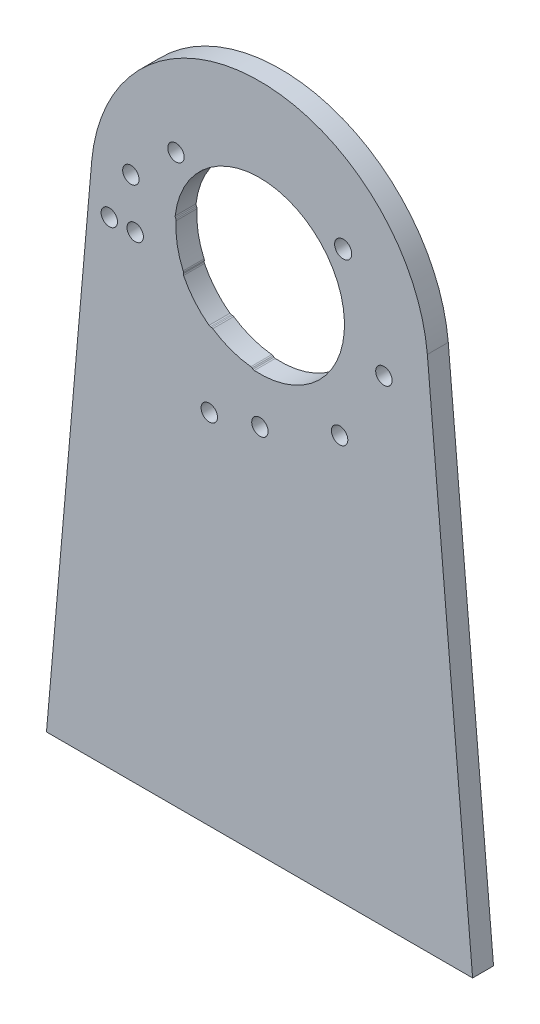
ISO-10303-21;
HEADER;
FILE_DESCRIPTION(('STEP AP214'),'2;1');
FILE_NAME('part.step','',(''),(''),'','','');
FILE_SCHEMA(('AUTOMOTIVE_DESIGN { 1 0 10303 214 1 1 1 1 }'));
ENDSEC;
DATA;
#1=APPLICATION_CONTEXT('core data for automotive mechanical design processes');
#2=APPLICATION_PROTOCOL_DEFINITION('international standard','automotive_design',2000,#1);
#3=PRODUCT_CONTEXT('',#1,'mechanical');
#4=PRODUCT('Part','Part','',(#3));
#5=PRODUCT_RELATED_PRODUCT_CATEGORY('part','',(#4));
#6=PRODUCT_DEFINITION_FORMATION('','',#4);
#7=PRODUCT_DEFINITION_CONTEXT('part definition',#1,'design');
#8=PRODUCT_DEFINITION('design','',#6,#7);
#9=PRODUCT_DEFINITION_SHAPE('','',#8);
#10=(LENGTH_UNIT() NAMED_UNIT(*) SI_UNIT(.MILLI.,.METRE.));
#11=(NAMED_UNIT(*) PLANE_ANGLE_UNIT() SI_UNIT($,.RADIAN.));
#12=(NAMED_UNIT(*) SI_UNIT($,.STERADIAN.) SOLID_ANGLE_UNIT());
#13=UNCERTAINTY_MEASURE_WITH_UNIT(LENGTH_MEASURE(1.E-05),#10,'distance_accuracy_value','');
#14=(GEOMETRIC_REPRESENTATION_CONTEXT(3) GLOBAL_UNCERTAINTY_ASSIGNED_CONTEXT((#13)) GLOBAL_UNIT_ASSIGNED_CONTEXT((#10,
#11,#12)) REPRESENTATION_CONTEXT('',''));
#15=CARTESIAN_POINT('',(0.,0.,0.));
#16=DIRECTION('',(0.,0.,1.));
#17=DIRECTION('',(1.,0.,0.));
#18=AXIS2_PLACEMENT_3D('',#15,#16,#17);
#19=CARTESIAN_POINT('',(461.444713808389,195.326,6.35));
#20=DIRECTION('',(0.,0.,1.));
#21=DIRECTION('',(1.,0.,0.));
#22=AXIS2_PLACEMENT_3D('',#19,#20,#21);
#23=PLANE('',#22);
#24=CARTESIAN_POINT('',(422.353220898632,202.330354144289,6.35));
#25=DIRECTION('',(0.,0.,1.));
#26=DIRECTION('',(1.,0.,0.));
#27=AXIS2_PLACEMENT_3D('',#24,#25,#26);
#28=CIRCLE('',#27,2.48919999947282);
#29=CARTESIAN_POINT('',(424.842420898104,202.330354144289,6.35));
#30=VERTEX_POINT('',#29);
#31=EDGE_CURVE('E521',#30,#30,#28,.T.);
#32=ORIENTED_EDGE('',*,*,#31,.F.);
#33=EDGE_LOOP('',(#32));
#34=FACE_BOUND('',#33,.T.);
#35=CARTESIAN_POINT('',(499.212852118392,187.870994066722,6.35));
#36=DIRECTION('',(0.,0.,1.));
#37=DIRECTION('',(1.,0.,0.));
#38=AXIS2_PLACEMENT_3D('',#35,#36,#37);
#39=CIRCLE('',#38,2.48919999890583);
#40=CARTESIAN_POINT('',(501.702052117298,187.870994066722,6.35));
#41=VERTEX_POINT('',#40);
#42=EDGE_CURVE('E540',#41,#41,#39,.T.);
#43=ORIENTED_EDGE('',*,*,#42,.F.);
#44=EDGE_LOOP('',(#43));
#45=FACE_BOUND('',#44,.T.);
#46=CARTESIAN_POINT('',(485.770599058357,165.488763336674,6.35));
#47=DIRECTION('',(0.,0.,1.));
#48=DIRECTION('',(1.,0.,0.));
#49=AXIS2_PLACEMENT_3D('',#46,#47,#48);
#50=CIRCLE('',#49,2.48919999692566);
#51=CARTESIAN_POINT('',(488.259799055283,165.488763336674,6.35));
#52=VERTEX_POINT('',#51);
#53=EDGE_CURVE('E539',#52,#52,#50,.T.);
#54=ORIENTED_EDGE('',*,*,#53,.F.);
#55=EDGE_LOOP('',(#54));
#56=FACE_BOUND('',#55,.T.);
#57=CARTESIAN_POINT('',(415.800165798263,187.870994066722,6.35));
#58=DIRECTION('',(0.,0.,1.));
#59=DIRECTION('',(1.,0.,0.));
#60=AXIS2_PLACEMENT_3D('',#57,#58,#59);
#61=CIRCLE('',#60,2.48919999939926);
#62=CARTESIAN_POINT('',(418.289365797663,187.870994066722,6.35));
#63=VERTEX_POINT('',#62);
#64=EDGE_CURVE('E532',#63,#63,#61,.T.);
#65=ORIENTED_EDGE('',*,*,#64,.F.);
#66=EDGE_LOOP('',(#65));
#67=FACE_BOUND('',#66,.T.);
#68=DIRECTION('',(-0.087155742747404,-0.996194698091768,0.));
#69=VECTOR('',#68,1.);
#70=CARTESIAN_POINT('',(438.327565167459,184.801863992082,6.35));
#71=LINE('',#70,#69);
#72=CARTESIAN_POINT('',(438.309515675378,184.595557353553,6.35));
#73=VERTEX_POINT('',#72);
#74=CARTESIAN_POINT('',(438.278235551917,184.238023906358,6.35));
#75=VERTEX_POINT('',#74);
#76=EDGE_CURVE('E361',#73,#75,#71,.T.);
#77=ORIENTED_EDGE('',*,*,#76,.F.);
#78=CARTESIAN_POINT('',(437.518786133768,184.664737224358,6.35));
#79=DIRECTION('',(0.,0.,1.));
#80=DIRECTION('',(1.,0.,0.));
#81=AXIS2_PLACEMENT_3D('',#78,#79,#80);
#82=CIRCLE('',#81,0.79375);
#83=CARTESIAN_POINT('',(438.24381424512,184.987805793317,6.35));
#84=VERTEX_POINT('',#83);
#85=EDGE_CURVE('E251',#73,#84,#82,.T.);
#86=ORIENTED_EDGE('',*,*,#85,.T.);
#87=CARTESIAN_POINT('',(461.444713808389,195.326,6.35));
#88=DIRECTION('',(0.,0.,1.));
#89=DIRECTION('',(-1.,0.,0.));
#90=AXIS2_PLACEMENT_3D('',#87,#88,#89);
#91=CIRCLE('',#90,25.4);
#92=CARTESIAN_POINT('',(436.107129028892,197.105549814358,6.35));
#93=VERTEX_POINT('',#92);
#94=EDGE_CURVE('E350',#93,#84,#91,.T.);
#95=ORIENTED_EDGE('',*,*,#94,.F.);
#96=CARTESIAN_POINT('',(435.315329504532,197.161160746056,6.35));
#97=DIRECTION('',(0.,0.,1.));
#98=DIRECTION('',(1.,0.,0.));
#99=AXIS2_PLACEMENT_3D('',#96,#97,#98);
#100=CIRCLE('',#99,0.79375);
#101=CARTESIAN_POINT('',(436.034711310493,197.496613991313,6.35));
#102=VERTEX_POINT('',#101);
#103=EDGE_CURVE('E242',#93,#102,#100,.T.);
#104=ORIENTED_EDGE('',*,*,#103,.T.);
#105=DIRECTION('',(0.42261826174105,-0.906307787036487,0.));
#106=VECTOR('',#105,1.);
#107=CARTESIAN_POINT('',(435.789216805141,198.023078656986,6.35));
#108=LINE('',#107,#106);
#109=CARTESIAN_POINT('',(435.883033968447,197.821887101015,6.35));
#110=VERTEX_POINT('',#109);
#111=EDGE_CURVE('E342',#110,#102,#108,.T.);
#112=ORIENTED_EDGE('',*,*,#111,.F.);
#113=CARTESIAN_POINT('',(436.602415774407,198.157340346272,6.35));
#114=DIRECTION('',(0.,0.,1.));
#115=DIRECTION('',(1.,0.,0.));
#116=AXIS2_PLACEMENT_3D('',#113,#114,#115);
#117=CIRCLE('',#116,0.79375);
#118=CARTESIAN_POINT('',(435.813771392376,198.247224166789,6.35));
#119=VERTEX_POINT('',#118);
#120=EDGE_CURVE('E11',#110,#119,#117,.F.);
#121=ORIENTED_EDGE('',*,*,#120,.T.);
#122=CARTESIAN_POINT('',(461.444713808389,195.326,6.35));
#123=DIRECTION('',(0.,0.,1.));
#124=DIRECTION('',(1.,0.,0.));
#125=AXIS2_PLACEMENT_3D('',#122,#123,#124);
#126=CIRCLE('',#125,25.796875);
#127=CARTESIAN_POINT('',(459.870791573917,169.577183938568,6.35));
#128=VERTEX_POINT('',#127);
#129=EDGE_CURVE('E340',#128,#119,#126,.T.);
#130=ORIENTED_EDGE('',*,*,#129,.F.);
#131=CARTESIAN_POINT('',(459.919219950362,170.369455201997,6.35));
#132=DIRECTION('',(0.,0.,1.));
#133=DIRECTION('',(1.,0.,0.));
#134=AXIS2_PLACEMENT_3D('',#131,#132,#133);
#135=CIRCLE('',#134,0.79375);
#136=CARTESIAN_POINT('',(459.463943654012,169.71925326684,6.35));
#137=VERTEX_POINT('',#136);
#138=EDGE_CURVE('E309',#128,#137,#135,.F.);
#139=ORIENTED_EDGE('',*,*,#138,.T.);
#140=DIRECTION('',(0.819152044291804,-0.57357643634703,0.));
#141=VECTOR('',#140,1.);
#142=CARTESIAN_POINT('',(459.000308623878,170.043894009914,6.35));
#143=LINE('',#142,#141);
#144=CARTESIAN_POINT('',(459.169950667775,169.925109371982,6.35));
#145=VERTEX_POINT('',#144);
#146=EDGE_CURVE('E376',#145,#137,#143,.T.);
#147=ORIENTED_EDGE('',*,*,#146,.F.);
#148=CARTESIAN_POINT('',(458.714674371425,169.274907436825,6.35));
#149=DIRECTION('',(0.,0.,1.));
#150=DIRECTION('',(1.,0.,0.));
#151=AXIS2_PLACEMENT_3D('',#148,#149,#150);
#152=CIRCLE('',#151,0.79375);
#153=CARTESIAN_POINT('',(458.797402839212,170.064334484194,6.35));
#154=VERTEX_POINT('',#153);
#155=EDGE_CURVE('E245',#145,#154,#152,.T.);
#156=ORIENTED_EDGE('',*,*,#155,.T.);
#157=CARTESIAN_POINT('',(461.444713808389,195.326,6.35));
#158=DIRECTION('',(0.,0.,1.));
#159=DIRECTION('',(1.,0.,0.));
#160=AXIS2_PLACEMENT_3D('',#157,#158,#159);
#161=CIRCLE('',#160,25.4);
#162=CARTESIAN_POINT('',(447.234786072284,174.272782817473,6.35));
#163=VERTEX_POINT('',#162);
#164=EDGE_CURVE('E372',#163,#154,#161,.T.);
#165=ORIENTED_EDGE('',*,*,#164,.F.);
#166=CARTESIAN_POINT('',(446.790725830531,173.614869780519,6.35));
#167=DIRECTION('',(0.,0.,1.));
#168=DIRECTION('',(1.,0.,0.));
#169=AXIS2_PLACEMENT_3D('',#166,#167,#168);
#170=CIRCLE('',#169,0.79375);
#171=CARTESIAN_POINT('',(446.859905701333,174.405599322129,6.35));
#172=VERTEX_POINT('',#171);
#173=EDGE_CURVE('E248',#163,#172,#170,.T.);
#174=ORIENTED_EDGE('',*,*,#173,.T.);
#175=DIRECTION('',(0.996194698092168,-0.0871557427428261,0.));
#176=VECTOR('',#175,1.);
#177=CARTESIAN_POINT('',(447.066212339861,174.387549830049,6.35));
#178=LINE('',#177,#176);
#179=CARTESIAN_POINT('',(446.502372254131,174.436879445589,6.35));
#180=VERTEX_POINT('',#179);
#181=EDGE_CURVE('E368',#180,#172,#178,.T.);
#182=ORIENTED_EDGE('',*,*,#181,.F.);
#183=CARTESIAN_POINT('',(446.571552124934,175.2276089872,6.35));
#184=DIRECTION('',(0.,0.,1.));
#185=DIRECTION('',(1.,0.,0.));
#186=AXIS2_PLACEMENT_3D('',#183,#184,#185);
#187=CIRCLE('',#186,0.79375);
#188=CARTESIAN_POINT('',(446.099388261967,174.589564828063,6.35));
#189=VERTEX_POINT('',#188);
#190=EDGE_CURVE('E59',#180,#189,#187,.F.);
#191=ORIENTED_EDGE('',*,*,#190,.T.);
#192=CARTESIAN_POINT('',(461.444713808389,195.326,6.35));
#193=DIRECTION('',(0.,0.,1.));
#194=DIRECTION('',(1.,0.,0.));
#195=AXIS2_PLACEMENT_3D('',#192,#193,#194);
#196=CIRCLE('',#195,25.7968750000001);
#197=CARTESIAN_POINT('',(438.358623864484,183.81464860811,6.35));
#198=VERTEX_POINT('',#197);
#199=EDGE_CURVE('E365',#198,#189,#196,.T.);
#200=ORIENTED_EDGE('',*,*,#199,.F.);
#201=CARTESIAN_POINT('',(439.068965093528,184.168844035553,6.35));
#202=DIRECTION('',(0.,0.,1.));
#203=DIRECTION('',(1.,0.,0.));
#204=AXIS2_PLACEMENT_3D('',#201,#202,#203);
#205=CIRCLE('',#204,0.79375);
#206=EDGE_CURVE('E298',#198,#75,#205,.F.);
#207=ORIENTED_EDGE('',*,*,#206,.T.);
#208=EDGE_LOOP('',(#77,#86,#95,#104,#112,#121,#130,#139,#147,#156,#165,#174,#182,#191,#200,#207));
#209=FACE_BOUND('',#208,.T.);
#210=CARTESIAN_POINT('',(436.044713808389,215.030354144849,6.35));
#211=DIRECTION('',(0.,0.,1.));
#212=DIRECTION('',(1.,0.,0.));
#213=AXIS2_PLACEMENT_3D('',#210,#211,#212);
#214=CIRCLE('',#213,2.48920000000001);
#215=CARTESIAN_POINT('',(438.533913808389,215.030354144849,6.35));
#216=VERTEX_POINT('',#215);
#217=EDGE_CURVE('E402',#216,#216,#214,.T.);
#218=ORIENTED_EDGE('',*,*,#217,.F.);
#219=EDGE_LOOP('',(#218));
#220=FACE_BOUND('',#219,.T.);
#221=DIRECTION('',(1.,0.,0.));
#222=VECTOR('',#221,1.);
#223=CARTESIAN_POINT('',(396.719894642624,42.926,6.35));
#224=LINE('',#223,#222);
#225=CARTESIAN_POINT('',(396.719894642624,42.926,6.35));
#226=VERTEX_POINT('',#225);
#227=CARTESIAN_POINT('',(526.169532974154,42.926,6.35));
#228=VERTEX_POINT('',#227);
#229=EDGE_CURVE('E194',#226,#228,#224,.T.);
#230=ORIENTED_EDGE('',*,*,#229,.T.);
#231=DIRECTION('',(-0.0871557427476583,0.996194698091746,0.));
#232=VECTOR('',#231,1.);
#233=CARTESIAN_POINT('',(512.419595892761,200.0885,6.35));
#234=LINE('',#233,#232);
#235=CARTESIAN_POINT('',(512.419595892761,200.0885,6.35));
#236=VERTEX_POINT('',#235);
#237=EDGE_CURVE('E182',#228,#236,#234,.T.);
#238=ORIENTED_EDGE('',*,*,#237,.T.);
#239=CARTESIAN_POINT('',(461.444713808389,195.326,6.35));
#240=DIRECTION('',(0.,0.,1.));
#241=DIRECTION('',(1.,0.,0.));
#242=AXIS2_PLACEMENT_3D('',#239,#240,#241);
#243=CIRCLE('',#242,51.196875);
#244=CARTESIAN_POINT('',(410.469831724017,200.0885,6.35));
#245=VERTEX_POINT('',#244);
#246=EDGE_CURVE('E193',#236,#245,#243,.T.);
#247=ORIENTED_EDGE('',*,*,#246,.T.);
#248=DIRECTION('',(-0.0871557427476583,-0.996194698091746,0.));
#249=VECTOR('',#248,1.);
#250=CARTESIAN_POINT('',(410.469831724017,200.0885,6.35));
#251=LINE('',#250,#249);
#252=EDGE_CURVE('E199',#245,#226,#251,.T.);
#253=ORIENTED_EDGE('',*,*,#252,.T.);
#254=EDGE_LOOP('',(#230,#238,#247,#253));
#255=FACE_BOUND('',#254,.T.);
#256=CARTESIAN_POINT('',(486.844713808389,215.030354144849,6.35));
#257=DIRECTION('',(0.,0.,1.));
#258=DIRECTION('',(1.,0.,0.));
#259=AXIS2_PLACEMENT_3D('',#256,#257,#258);
#260=CIRCLE('',#259,2.60349999999999);
#261=CARTESIAN_POINT('',(489.448213808389,215.030354144849,6.35));
#262=VERTEX_POINT('',#261);
#263=EDGE_CURVE('E332',#262,#262,#260,.T.);
#264=ORIENTED_EDGE('',*,*,#263,.F.);
#265=EDGE_LOOP('',(#264));
#266=FACE_BOUND('',#265,.T.);
#267=CARTESIAN_POINT('',(446.176873582374,151.669443430463,6.35));
#268=DIRECTION('',(0.,0.,-1.));
#269=DIRECTION('',(-1.,0.,0.));
#270=AXIS2_PLACEMENT_3D('',#267,#268,#269);
#271=CIRCLE('',#270,2.48920000189329);
#272=CARTESIAN_POINT('',(443.68767358048,151.669443430463,6.35));
#273=VERTEX_POINT('',#272);
#274=EDGE_CURVE('E559',#273,#273,#271,.T.);
#275=ORIENTED_EDGE('',*,*,#274,.T.);
#276=EDGE_LOOP('',(#275));
#277=FACE_BOUND('',#276,.T.);
#278=CARTESIAN_POINT('',(461.554489567047,155.612101370116,6.35));
#279=DIRECTION('',(0.,0.,-1.));
#280=DIRECTION('',(-1.,0.,0.));
#281=AXIS2_PLACEMENT_3D('',#278,#279,#280);
#282=CIRCLE('',#281,2.48920000227902);
#283=CARTESIAN_POINT('',(459.065289564768,155.612101370116,6.35));
#284=VERTEX_POINT('',#283);
#285=EDGE_CURVE('E567',#284,#284,#282,.T.);
#286=ORIENTED_EDGE('',*,*,#285,.T.);
#287=EDGE_LOOP('',(#286));
#288=FACE_BOUND('',#287,.T.);
#289=CARTESIAN_POINT('',(423.676575498386,187.870994066722,6.35));
#290=DIRECTION('',(0.,0.,-1.));
#291=DIRECTION('',(-1.,0.,0.));
#292=AXIS2_PLACEMENT_3D('',#289,#290,#291);
#293=CIRCLE('',#292,2.48920000135015);
#294=CARTESIAN_POINT('',(421.187375497036,187.870994066722,6.35));
#295=VERTEX_POINT('',#294);
#296=EDGE_CURVE('E548',#295,#295,#293,.T.);
#297=ORIENTED_EDGE('',*,*,#296,.T.);
#298=EDGE_LOOP('',(#297));
#299=FACE_BOUND('',#298,.T.);
#300=ADVANCED_FACE('F43',(#34,#45,#56,#67,#209,#220,#255,#266,#277,#288,#299),#23,.T.);
#301=CARTESIAN_POINT('',(461.444713808389,195.326,0.));
#302=DIRECTION('',(0.,0.,1.));
#303=DIRECTION('',(1.,0.,0.));
#304=AXIS2_PLACEMENT_3D('',#301,#302,#303);
#305=PLANE('',#304);
#306=CARTESIAN_POINT('',(422.353220898632,202.330354144289,0.));
#307=DIRECTION('',(0.,0.,1.));
#308=DIRECTION('',(1.,0.,0.));
#309=AXIS2_PLACEMENT_3D('',#306,#307,#308);
#310=CIRCLE('',#309,2.48919999947282);
#311=CARTESIAN_POINT('',(424.842420898104,202.330354144289,0.));
#312=VERTEX_POINT('',#311);
#313=EDGE_CURVE('E524',#312,#312,#310,.T.);
#314=ORIENTED_EDGE('',*,*,#313,.T.);
#315=EDGE_LOOP('',(#314));
#316=FACE_BOUND('',#315,.T.);
#317=CARTESIAN_POINT('',(461.554489567047,155.612101370116,0.));
#318=DIRECTION('',(0.,0.,-1.));
#319=DIRECTION('',(-1.,0.,0.));
#320=AXIS2_PLACEMENT_3D('',#317,#318,#319);
#321=CIRCLE('',#320,2.48920000227902);
#322=CARTESIAN_POINT('',(459.065289564768,155.612101370116,0.));
#323=VERTEX_POINT('',#322);
#324=EDGE_CURVE('E563',#323,#323,#321,.T.);
#325=ORIENTED_EDGE('',*,*,#324,.F.);
#326=EDGE_LOOP('',(#325));
#327=FACE_BOUND('',#326,.T.);
#328=CARTESIAN_POINT('',(486.844713808389,215.030354144849,0.));
#329=DIRECTION('',(0.,0.,1.));
#330=DIRECTION('',(1.,0.,0.));
#331=AXIS2_PLACEMENT_3D('',#328,#329,#330);
#332=CIRCLE('',#331,2.60349999999999);
#333=CARTESIAN_POINT('',(489.448213808389,215.030354144849,0.));
#334=VERTEX_POINT('',#333);
#335=EDGE_CURVE('E355',#334,#334,#332,.T.);
#336=ORIENTED_EDGE('',*,*,#335,.T.);
#337=EDGE_LOOP('',(#336));
#338=FACE_BOUND('',#337,.T.);
#339=CARTESIAN_POINT('',(461.444713808389,195.326,0.));
#340=DIRECTION('',(0.,0.,1.));
#341=DIRECTION('',(-1.,0.,0.));
#342=AXIS2_PLACEMENT_3D('',#339,#340,#341);
#343=CIRCLE('',#342,25.4);
#344=CARTESIAN_POINT('',(436.107129028892,197.105549814358,0.));
#345=VERTEX_POINT('',#344);
#346=CARTESIAN_POINT('',(438.24381424512,184.987805793317,0.));
#347=VERTEX_POINT('',#346);
#348=EDGE_CURVE('E331',#345,#347,#343,.T.);
#349=ORIENTED_EDGE('',*,*,#348,.T.);
#350=CARTESIAN_POINT('',(437.518786133768,184.664737224358,0.));
#351=DIRECTION('',(0.,0.,1.));
#352=DIRECTION('',(1.,0.,0.));
#353=AXIS2_PLACEMENT_3D('',#350,#351,#352);
#354=CIRCLE('',#353,0.79375);
#355=CARTESIAN_POINT('',(438.309515675378,184.595557353553,0.));
#356=VERTEX_POINT('',#355);
#357=EDGE_CURVE('E232',#347,#356,#354,.F.);
#358=ORIENTED_EDGE('',*,*,#357,.T.);
#359=DIRECTION('',(-0.087155742747404,-0.996194698091768,0.));
#360=VECTOR('',#359,1.);
#361=CARTESIAN_POINT('',(438.327565167459,184.801863992082,0.));
#362=LINE('',#361,#360);
#363=CARTESIAN_POINT('',(438.278235551917,184.238023906358,0.));
#364=VERTEX_POINT('',#363);
#365=EDGE_CURVE('E383',#356,#364,#362,.T.);
#366=ORIENTED_EDGE('',*,*,#365,.T.);
#367=CARTESIAN_POINT('',(439.068965093528,184.168844035553,0.));
#368=DIRECTION('',(0.,0.,1.));
#369=DIRECTION('',(1.,0.,0.));
#370=AXIS2_PLACEMENT_3D('',#367,#368,#369);
#371=CIRCLE('',#370,0.79375);
#372=CARTESIAN_POINT('',(438.358623864484,183.81464860811,0.));
#373=VERTEX_POINT('',#372);
#374=EDGE_CURVE('E295',#364,#373,#371,.T.);
#375=ORIENTED_EDGE('',*,*,#374,.T.);
#376=CARTESIAN_POINT('',(461.444713808389,195.326,0.));
#377=DIRECTION('',(0.,0.,1.));
#378=DIRECTION('',(1.,0.,0.));
#379=AXIS2_PLACEMENT_3D('',#376,#377,#378);
#380=CIRCLE('',#379,25.7968750000001);
#381=CARTESIAN_POINT('',(446.099388261967,174.589564828063,0.));
#382=VERTEX_POINT('',#381);
#383=EDGE_CURVE('E387',#373,#382,#380,.T.);
#384=ORIENTED_EDGE('',*,*,#383,.T.);
#385=CARTESIAN_POINT('',(446.571552124934,175.2276089872,0.));
#386=DIRECTION('',(0.,0.,1.));
#387=DIRECTION('',(1.,0.,0.));
#388=AXIS2_PLACEMENT_3D('',#385,#386,#387);
#389=CIRCLE('',#388,0.79375);
#390=CARTESIAN_POINT('',(446.502372254131,174.436879445589,0.));
#391=VERTEX_POINT('',#390);
#392=EDGE_CURVE('E301',#382,#391,#389,.T.);
#393=ORIENTED_EDGE('',*,*,#392,.T.);
#394=DIRECTION('',(0.996194698092168,-0.0871557427428261,0.));
#395=VECTOR('',#394,1.);
#396=CARTESIAN_POINT('',(447.066212339861,174.387549830049,0.));
#397=LINE('',#396,#395);
#398=CARTESIAN_POINT('',(446.859905701333,174.405599322129,0.));
#399=VERTEX_POINT('',#398);
#400=EDGE_CURVE('E391',#391,#399,#397,.T.);
#401=ORIENTED_EDGE('',*,*,#400,.T.);
#402=CARTESIAN_POINT('',(446.790725830531,173.614869780519,0.));
#403=DIRECTION('',(0.,0.,1.));
#404=DIRECTION('',(1.,0.,0.));
#405=AXIS2_PLACEMENT_3D('',#402,#403,#404);
#406=CIRCLE('',#405,0.79375);
#407=CARTESIAN_POINT('',(447.234786072284,174.272782817473,0.));
#408=VERTEX_POINT('',#407);
#409=EDGE_CURVE('E229',#399,#408,#406,.F.);
#410=ORIENTED_EDGE('',*,*,#409,.T.);
#411=CARTESIAN_POINT('',(461.444713808389,195.326,0.));
#412=DIRECTION('',(0.,0.,1.));
#413=DIRECTION('',(1.,0.,0.));
#414=AXIS2_PLACEMENT_3D('',#411,#412,#413);
#415=CIRCLE('',#414,25.4);
#416=CARTESIAN_POINT('',(458.797402839212,170.064334484194,0.));
#417=VERTEX_POINT('',#416);
#418=EDGE_CURVE('E395',#408,#417,#415,.T.);
#419=ORIENTED_EDGE('',*,*,#418,.T.);
#420=CARTESIAN_POINT('',(458.714674371425,169.274907436825,0.));
#421=DIRECTION('',(0.,0.,1.));
#422=DIRECTION('',(1.,0.,0.));
#423=AXIS2_PLACEMENT_3D('',#420,#421,#422);
#424=CIRCLE('',#423,0.79375);
#425=CARTESIAN_POINT('',(459.169950667775,169.925109371982,0.));
#426=VERTEX_POINT('',#425);
#427=EDGE_CURVE('E226',#417,#426,#424,.F.);
#428=ORIENTED_EDGE('',*,*,#427,.T.);
#429=DIRECTION('',(0.819152044291804,-0.57357643634703,0.));
#430=VECTOR('',#429,1.);
#431=CARTESIAN_POINT('',(459.000308623878,170.043894009914,0.));
#432=LINE('',#431,#430);
#433=CARTESIAN_POINT('',(459.463943654012,169.71925326684,0.));
#434=VERTEX_POINT('',#433);
#435=EDGE_CURVE('E352',#426,#434,#432,.T.);
#436=ORIENTED_EDGE('',*,*,#435,.T.);
#437=CARTESIAN_POINT('',(459.919219950362,170.369455201997,0.));
#438=DIRECTION('',(0.,0.,1.));
#439=DIRECTION('',(1.,0.,0.));
#440=AXIS2_PLACEMENT_3D('',#437,#438,#439);
#441=CIRCLE('',#440,0.79375);
#442=CARTESIAN_POINT('',(459.870791573917,169.577183938568,0.));
#443=VERTEX_POINT('',#442);
#444=EDGE_CURVE('E306',#434,#443,#441,.T.);
#445=ORIENTED_EDGE('',*,*,#444,.T.);
#446=CARTESIAN_POINT('',(461.444713808389,195.326,0.));
#447=DIRECTION('',(0.,0.,1.));
#448=DIRECTION('',(-1.,0.,0.));
#449=AXIS2_PLACEMENT_3D('',#446,#447,#448);
#450=CIRCLE('',#449,25.7968750000001);
#451=CARTESIAN_POINT('',(435.813771392376,198.247224166789,0.));
#452=VERTEX_POINT('',#451);
#453=EDGE_CURVE('E321',#443,#452,#450,.T.);
#454=ORIENTED_EDGE('',*,*,#453,.T.);
#455=CARTESIAN_POINT('',(436.602415774407,198.157340346272,0.));
#456=DIRECTION('',(0.,0.,1.));
#457=DIRECTION('',(1.,0.,0.));
#458=AXIS2_PLACEMENT_3D('',#455,#456,#457);
#459=CIRCLE('',#458,0.79375);
#460=CARTESIAN_POINT('',(435.883033968447,197.821887101015,0.));
#461=VERTEX_POINT('',#460);
#462=EDGE_CURVE('E52',#452,#461,#459,.T.);
#463=ORIENTED_EDGE('',*,*,#462,.T.);
#464=DIRECTION('',(0.42261826174105,-0.906307787036487,0.));
#465=VECTOR('',#464,1.);
#466=CARTESIAN_POINT('',(435.789216805141,198.023078656986,0.));
#467=LINE('',#466,#465);
#468=CARTESIAN_POINT('',(436.034711310493,197.496613991313,0.));
#469=VERTEX_POINT('',#468);
#470=EDGE_CURVE('E319',#461,#469,#467,.T.);
#471=ORIENTED_EDGE('',*,*,#470,.T.);
#472=CARTESIAN_POINT('',(435.315329504532,197.161160746056,0.));
#473=DIRECTION('',(0.,0.,1.));
#474=DIRECTION('',(1.,0.,0.));
#475=AXIS2_PLACEMENT_3D('',#472,#473,#474);
#476=CIRCLE('',#475,0.79375);
#477=EDGE_CURVE('E223',#469,#345,#476,.F.);
#478=ORIENTED_EDGE('',*,*,#477,.T.);
#479=EDGE_LOOP('',(#349,#358,#366,#375,#384,#393,#401,#410,#419,#428,#436,#445,#454,#463,#471,#478));
#480=FACE_BOUND('',#479,.T.);
#481=DIRECTION('',(1.,0.,0.));
#482=VECTOR('',#481,1.);
#483=CARTESIAN_POINT('',(396.719894642624,42.926,0.));
#484=LINE('',#483,#482);
#485=CARTESIAN_POINT('',(396.719894642624,42.926,0.));
#486=VERTEX_POINT('',#485);
#487=CARTESIAN_POINT('',(526.169532974154,42.926,0.));
#488=VERTEX_POINT('',#487);
#489=EDGE_CURVE('E208',#486,#488,#484,.T.);
#490=ORIENTED_EDGE('',*,*,#489,.F.);
#491=DIRECTION('',(-0.0871557427476583,-0.996194698091746,0.));
#492=VECTOR('',#491,1.);
#493=CARTESIAN_POINT('',(410.469831724017,200.0885,0.));
#494=LINE('',#493,#492);
#495=CARTESIAN_POINT('',(410.469831724017,200.0885,0.));
#496=VERTEX_POINT('',#495);
#497=EDGE_CURVE('E204',#496,#486,#494,.T.);
#498=ORIENTED_EDGE('',*,*,#497,.F.);
#499=CARTESIAN_POINT('',(461.444713808389,195.326,0.));
#500=DIRECTION('',(0.,0.,1.));
#501=DIRECTION('',(1.,0.,0.));
#502=AXIS2_PLACEMENT_3D('',#499,#500,#501);
#503=CIRCLE('',#502,51.196875);
#504=CARTESIAN_POINT('',(512.419595892761,200.0885,0.));
#505=VERTEX_POINT('',#504);
#506=EDGE_CURVE('E419',#505,#496,#503,.T.);
#507=ORIENTED_EDGE('',*,*,#506,.F.);
#508=DIRECTION('',(-0.0871557427476583,0.996194698091746,0.));
#509=VECTOR('',#508,1.);
#510=CARTESIAN_POINT('',(512.419595892761,200.0885,0.));
#511=LINE('',#510,#509);
#512=EDGE_CURVE('E416',#488,#505,#511,.T.);
#513=ORIENTED_EDGE('',*,*,#512,.F.);
#514=EDGE_LOOP('',(#490,#498,#507,#513));
#515=FACE_BOUND('',#514,.T.);
#516=CARTESIAN_POINT('',(436.044713808389,215.030354144849,0.));
#517=DIRECTION('',(0.,0.,1.));
#518=DIRECTION('',(1.,0.,0.));
#519=AXIS2_PLACEMENT_3D('',#516,#517,#518);
#520=CIRCLE('',#519,2.48920000000001);
#521=CARTESIAN_POINT('',(438.533913808389,215.030354144849,0.));
#522=VERTEX_POINT('',#521);
#523=EDGE_CURVE('E379',#522,#522,#520,.T.);
#524=ORIENTED_EDGE('',*,*,#523,.T.);
#525=EDGE_LOOP('',(#524));
#526=FACE_BOUND('',#525,.T.);
#527=CARTESIAN_POINT('',(415.800165798263,187.870994066722,0.));
#528=DIRECTION('',(0.,0.,1.));
#529=DIRECTION('',(1.,0.,0.));
#530=AXIS2_PLACEMENT_3D('',#527,#528,#529);
#531=CIRCLE('',#530,2.48919999939926);
#532=CARTESIAN_POINT('',(418.289365797663,187.870994066722,0.));
#533=VERTEX_POINT('',#532);
#534=EDGE_CURVE('E526',#533,#533,#531,.T.);
#535=ORIENTED_EDGE('',*,*,#534,.T.);
#536=EDGE_LOOP('',(#535));
#537=FACE_BOUND('',#536,.T.);
#538=CARTESIAN_POINT('',(446.176873582374,151.669443430463,0.));
#539=DIRECTION('',(0.,0.,-1.));
#540=DIRECTION('',(-1.,0.,0.));
#541=AXIS2_PLACEMENT_3D('',#538,#539,#540);
#542=CIRCLE('',#541,2.48920000189329);
#543=CARTESIAN_POINT('',(443.68767358048,151.669443430463,0.));
#544=VERTEX_POINT('',#543);
#545=EDGE_CURVE('E555',#544,#544,#542,.T.);
#546=ORIENTED_EDGE('',*,*,#545,.F.);
#547=EDGE_LOOP('',(#546));
#548=FACE_BOUND('',#547,.T.);
#549=CARTESIAN_POINT('',(485.770599058357,165.488763336674,0.));
#550=DIRECTION('',(0.,0.,1.));
#551=DIRECTION('',(1.,0.,0.));
#552=AXIS2_PLACEMENT_3D('',#549,#550,#551);
#553=CIRCLE('',#552,2.48919999692566);
#554=CARTESIAN_POINT('',(488.259799055283,165.488763336674,0.));
#555=VERTEX_POINT('',#554);
#556=EDGE_CURVE('E571',#555,#555,#553,.T.);
#557=ORIENTED_EDGE('',*,*,#556,.T.);
#558=EDGE_LOOP('',(#557));
#559=FACE_BOUND('',#558,.T.);
#560=CARTESIAN_POINT('',(499.212852118392,187.870994066722,0.));
#561=DIRECTION('',(0.,0.,1.));
#562=DIRECTION('',(1.,0.,0.));
#563=AXIS2_PLACEMENT_3D('',#560,#561,#562);
#564=CIRCLE('',#563,2.48919999890583);
#565=CARTESIAN_POINT('',(501.702052117298,187.870994066722,0.));
#566=VERTEX_POINT('',#565);
#567=EDGE_CURVE('E535',#566,#566,#564,.T.);
#568=ORIENTED_EDGE('',*,*,#567,.T.);
#569=EDGE_LOOP('',(#568));
#570=FACE_BOUND('',#569,.T.);
#571=CARTESIAN_POINT('',(423.676575498386,187.870994066722,0.));
#572=DIRECTION('',(0.,0.,-1.));
#573=DIRECTION('',(-1.,0.,0.));
#574=AXIS2_PLACEMENT_3D('',#571,#572,#573);
#575=CIRCLE('',#574,2.48920000135015);
#576=CARTESIAN_POINT('',(421.187375497036,187.870994066722,0.));
#577=VERTEX_POINT('',#576);
#578=EDGE_CURVE('E544',#577,#577,#575,.T.);
#579=ORIENTED_EDGE('',*,*,#578,.F.);
#580=EDGE_LOOP('',(#579));
#581=FACE_BOUND('',#580,.T.);
#582=ADVANCED_FACE('F317',(#316,#327,#338,#480,#515,#526,#537,#548,#559,#570,#581),#305,.F.);
#583=CARTESIAN_POINT('',(396.719894642624,42.926,6.35));
#584=DIRECTION('',(0.,1.,0.));
#585=DIRECTION('',(0.,0.,1.));
#586=AXIS2_PLACEMENT_3D('',#583,#584,#585);
#587=PLANE('',#586);
#588=ORIENTED_EDGE('',*,*,#489,.T.);
#589=DIRECTION('',(0.,0.,-1.));
#590=VECTOR('',#589,1.);
#591=CARTESIAN_POINT('',(526.169532974154,42.926,6.35));
#592=LINE('',#591,#590);
#593=EDGE_CURVE('E186',#228,#488,#592,.T.);
#594=ORIENTED_EDGE('',*,*,#593,.F.);
#595=ORIENTED_EDGE('',*,*,#229,.F.);
#596=DIRECTION('',(0.,0.,-1.));
#597=VECTOR('',#596,1.);
#598=CARTESIAN_POINT('',(396.719894642624,42.926,6.35));
#599=LINE('',#598,#597);
#600=EDGE_CURVE('E413',#226,#486,#599,.T.);
#601=ORIENTED_EDGE('',*,*,#600,.T.);
#602=EDGE_LOOP('',(#588,#594,#595,#601));
#603=FACE_BOUND('',#602,.T.);
#604=ADVANCED_FACE('F206',(#603),#587,.F.);
#605=CARTESIAN_POINT('',(512.419595892761,200.0885,6.35));
#606=DIRECTION('',(-0.996194698091746,-0.0871557427476583,0.));
#607=DIRECTION('',(0.0871557427476583,-0.996194698091746,0.));
#608=AXIS2_PLACEMENT_3D('',#605,#606,#607);
#609=PLANE('',#608);
#610=ORIENTED_EDGE('',*,*,#512,.T.);
#611=DIRECTION('',(0.,0.,-1.));
#612=VECTOR('',#611,1.);
#613=CARTESIAN_POINT('',(512.419595892761,200.0885,6.35));
#614=LINE('',#613,#612);
#615=EDGE_CURVE('E189',#236,#505,#614,.T.);
#616=ORIENTED_EDGE('',*,*,#615,.F.);
#617=ORIENTED_EDGE('',*,*,#237,.F.);
#618=ORIENTED_EDGE('',*,*,#593,.T.);
#619=EDGE_LOOP('',(#610,#616,#617,#618));
#620=FACE_BOUND('',#619,.T.);
#621=ADVANCED_FACE('F184',(#620),#609,.F.);
#622=CARTESIAN_POINT('',(461.444713808389,195.326,6.35));
#623=DIRECTION('',(0.,0.,-1.));
#624=DIRECTION('',(-1.,0.,0.));
#625=AXIS2_PLACEMENT_3D('',#622,#623,#624);
#626=CYLINDRICAL_SURFACE('',#625,51.196875);
#627=ORIENTED_EDGE('',*,*,#506,.T.);
#628=DIRECTION('',(0.,0.,-1.));
#629=VECTOR('',#628,1.);
#630=CARTESIAN_POINT('',(410.469831724017,200.0885,6.35));
#631=LINE('',#630,#629);
#632=EDGE_CURVE('E216',#245,#496,#631,.T.);
#633=ORIENTED_EDGE('',*,*,#632,.F.);
#634=ORIENTED_EDGE('',*,*,#246,.F.);
#635=ORIENTED_EDGE('',*,*,#615,.T.);
#636=EDGE_LOOP('',(#627,#633,#634,#635));
#637=FACE_BOUND('',#636,.T.);
#638=ADVANCED_FACE('F434',(#637),#626,.T.);
#639=CARTESIAN_POINT('',(410.469831724017,200.0885,6.35));
#640=DIRECTION('',(0.996194698091746,-0.0871557427476583,0.));
#641=DIRECTION('',(0.0871557427476583,0.996194698091746,0.));
#642=AXIS2_PLACEMENT_3D('',#639,#640,#641);
#643=PLANE('',#642);
#644=ORIENTED_EDGE('',*,*,#497,.T.);
#645=ORIENTED_EDGE('',*,*,#600,.F.);
#646=ORIENTED_EDGE('',*,*,#252,.F.);
#647=ORIENTED_EDGE('',*,*,#632,.T.);
#648=EDGE_LOOP('',(#644,#645,#646,#647));
#649=FACE_BOUND('',#648,.T.);
#650=ADVANCED_FACE('F430',(#649),#643,.F.);
#651=CARTESIAN_POINT('',(436.044713808389,215.030354144849,6.35));
#652=DIRECTION('',(0.,0.,-1.));
#653=DIRECTION('',(-1.,0.,0.));
#654=AXIS2_PLACEMENT_3D('',#651,#652,#653);
#655=CYLINDRICAL_SURFACE('',#654,2.48920000000001);
#656=ORIENTED_EDGE('',*,*,#217,.T.);
#657=EDGE_LOOP('',(#656));
#658=FACE_BOUND('',#657,.T.);
#659=ORIENTED_EDGE('',*,*,#523,.F.);
#660=EDGE_LOOP('',(#659));
#661=FACE_BOUND('',#660,.T.);
#662=ADVANCED_FACE('F441',(#658,#661),#655,.F.);
#663=CARTESIAN_POINT('',(435.789216805141,198.023078656986,6.35));
#664=DIRECTION('',(0.906307787036486,0.42261826174105,0.));
#665=DIRECTION('',(-0.42261826174105,0.906307787036486,0.));
#666=AXIS2_PLACEMENT_3D('',#663,#664,#665);
#667=PLANE('',#666);
#668=ORIENTED_EDGE('',*,*,#470,.F.);
#669=DIRECTION('',(0.,0.,1.));
#670=VECTOR('',#669,1.);
#671=CARTESIAN_POINT('',(435.883033968447,197.821887101015,6.35));
#672=LINE('',#671,#670);
#673=EDGE_CURVE('E292',#461,#110,#672,.T.);
#674=ORIENTED_EDGE('',*,*,#673,.T.);
#675=ORIENTED_EDGE('',*,*,#111,.T.);
#676=DIRECTION('',(0.,0.,-1.));
#677=VECTOR('',#676,1.);
#678=CARTESIAN_POINT('',(436.034711310493,197.496613991313,6.35));
#679=LINE('',#678,#677);
#680=EDGE_CURVE('E288',#102,#469,#679,.T.);
#681=ORIENTED_EDGE('',*,*,#680,.T.);
#682=EDGE_LOOP('',(#668,#674,#675,#681));
#683=FACE_BOUND('',#682,.T.);
#684=ADVANCED_FACE('F326',(#683),#667,.T.);
#685=CARTESIAN_POINT('',(461.444713808389,195.326,6.35));
#686=DIRECTION('',(0.,0.,-1.));
#687=DIRECTION('',(-1.,0.,0.));
#688=AXIS2_PLACEMENT_3D('',#685,#686,#687);
#689=CYLINDRICAL_SURFACE('',#688,25.4);
#690=ORIENTED_EDGE('',*,*,#94,.T.);
#691=DIRECTION('',(0.,0.,-1.));
#692=VECTOR('',#691,1.);
#693=CARTESIAN_POINT('',(438.24381424512,184.987805793317,6.35));
#694=LINE('',#693,#692);
#695=EDGE_CURVE('E214',#84,#347,#694,.T.);
#696=ORIENTED_EDGE('',*,*,#695,.T.);
#697=ORIENTED_EDGE('',*,*,#348,.F.);
#698=DIRECTION('',(0.,0.,-1.));
#699=VECTOR('',#698,1.);
#700=CARTESIAN_POINT('',(436.107129028892,197.105549814358,6.35));
#701=LINE('',#700,#699);
#702=EDGE_CURVE('E210',#345,#93,#701,.F.);
#703=ORIENTED_EDGE('',*,*,#702,.T.);
#704=EDGE_LOOP('',(#690,#696,#697,#703));
#705=FACE_BOUND('',#704,.T.);
#706=ADVANCED_FACE('F460',(#705),#689,.F.);
#707=CARTESIAN_POINT('',(438.327565167459,184.801863992082,6.35));
#708=DIRECTION('',(0.996194698091768,-0.087155742747404,0.));
#709=DIRECTION('',(0.087155742747404,0.996194698091768,0.));
#710=AXIS2_PLACEMENT_3D('',#707,#708,#709);
#711=PLANE('',#710);
#712=ORIENTED_EDGE('',*,*,#365,.F.);
#713=DIRECTION('',(0.,0.,-1.));
#714=VECTOR('',#713,1.);
#715=CARTESIAN_POINT('',(438.309515675378,184.595557353553,6.35));
#716=LINE('',#715,#714);
#717=EDGE_CURVE('E239',#356,#73,#716,.F.);
#718=ORIENTED_EDGE('',*,*,#717,.T.);
#719=ORIENTED_EDGE('',*,*,#76,.T.);
#720=DIRECTION('',(0.,0.,1.));
#721=VECTOR('',#720,1.);
#722=CARTESIAN_POINT('',(438.278235551917,184.238023906358,0.));
#723=LINE('',#722,#721);
#724=EDGE_CURVE('E235',#75,#364,#723,.F.);
#725=ORIENTED_EDGE('',*,*,#724,.T.);
#726=EDGE_LOOP('',(#712,#718,#719,#725));
#727=FACE_BOUND('',#726,.T.);
#728=ADVANCED_FACE('F463',(#727),#711,.T.);
#729=CARTESIAN_POINT('',(461.444713808389,195.326,6.35));
#730=DIRECTION('',(0.,0.,-1.));
#731=DIRECTION('',(-1.,0.,0.));
#732=AXIS2_PLACEMENT_3D('',#729,#730,#731);
#733=CYLINDRICAL_SURFACE('',#732,25.7968750000001);
#734=ORIENTED_EDGE('',*,*,#383,.F.);
#735=DIRECTION('',(0.,0.,-1.));
#736=VECTOR('',#735,1.);
#737=CARTESIAN_POINT('',(438.358623864484,183.81464860811,6.35));
#738=LINE('',#737,#736);
#739=EDGE_CURVE('E66',#373,#198,#738,.F.);
#740=ORIENTED_EDGE('',*,*,#739,.T.);
#741=ORIENTED_EDGE('',*,*,#199,.T.);
#742=DIRECTION('',(0.,0.,-1.));
#743=VECTOR('',#742,1.);
#744=CARTESIAN_POINT('',(446.099388261967,174.589564828063,6.35));
#745=LINE('',#744,#743);
#746=EDGE_CURVE('E254',#189,#382,#745,.T.);
#747=ORIENTED_EDGE('',*,*,#746,.T.);
#748=EDGE_LOOP('',(#734,#740,#741,#747));
#749=FACE_BOUND('',#748,.T.);
#750=ADVANCED_FACE('F467',(#749),#733,.F.);
#751=CARTESIAN_POINT('',(447.066212339861,174.387549830049,6.35));
#752=DIRECTION('',(0.0871557427428261,0.996194698092168,0.));
#753=DIRECTION('',(-0.996194698092168,0.0871557427428261,0.));
#754=AXIS2_PLACEMENT_3D('',#751,#752,#753);
#755=PLANE('',#754);
#756=ORIENTED_EDGE('',*,*,#400,.F.);
#757=DIRECTION('',(0.,0.,1.));
#758=VECTOR('',#757,1.);
#759=CARTESIAN_POINT('',(446.502372254131,174.436879445589,6.35));
#760=LINE('',#759,#758);
#761=EDGE_CURVE('E264',#391,#180,#760,.T.);
#762=ORIENTED_EDGE('',*,*,#761,.T.);
#763=ORIENTED_EDGE('',*,*,#181,.T.);
#764=DIRECTION('',(0.,0.,-1.));
#765=VECTOR('',#764,1.);
#766=CARTESIAN_POINT('',(446.859905701333,174.405599322129,6.35));
#767=LINE('',#766,#765);
#768=EDGE_CURVE('E260',#172,#399,#767,.T.);
#769=ORIENTED_EDGE('',*,*,#768,.T.);
#770=EDGE_LOOP('',(#756,#762,#763,#769));
#771=FACE_BOUND('',#770,.T.);
#772=ADVANCED_FACE('F471',(#771),#755,.T.);
#773=CARTESIAN_POINT('',(461.444713808389,195.326,6.35));
#774=DIRECTION('',(0.,0.,-1.));
#775=DIRECTION('',(-1.,0.,0.));
#776=AXIS2_PLACEMENT_3D('',#773,#774,#775);
#777=CYLINDRICAL_SURFACE('',#776,25.4);
#778=ORIENTED_EDGE('',*,*,#418,.F.);
#779=DIRECTION('',(0.,0.,-1.));
#780=VECTOR('',#779,1.);
#781=CARTESIAN_POINT('',(447.234786072284,174.272782817473,6.35));
#782=LINE('',#781,#780);
#783=EDGE_CURVE('E271',#408,#163,#782,.F.);
#784=ORIENTED_EDGE('',*,*,#783,.T.);
#785=ORIENTED_EDGE('',*,*,#164,.T.);
#786=DIRECTION('',(0.,0.,-1.));
#787=VECTOR('',#786,1.);
#788=CARTESIAN_POINT('',(458.797402839212,170.064334484194,6.35));
#789=LINE('',#788,#787);
#790=EDGE_CURVE('E267',#154,#417,#789,.T.);
#791=ORIENTED_EDGE('',*,*,#790,.T.);
#792=EDGE_LOOP('',(#778,#784,#785,#791));
#793=FACE_BOUND('',#792,.T.);
#794=ADVANCED_FACE('F474',(#793),#777,.F.);
#795=CARTESIAN_POINT('',(459.000308623878,170.043894009914,6.35));
#796=DIRECTION('',(0.57357643634703,0.819152044291804,0.));
#797=DIRECTION('',(-0.819152044291804,0.57357643634703,0.));
#798=AXIS2_PLACEMENT_3D('',#795,#796,#797);
#799=PLANE('',#798);
#800=ORIENTED_EDGE('',*,*,#435,.F.);
#801=DIRECTION('',(0.,0.,-1.));
#802=VECTOR('',#801,1.);
#803=CARTESIAN_POINT('',(459.169950667775,169.925109371982,6.35));
#804=LINE('',#803,#802);
#805=EDGE_CURVE('E278',#426,#145,#804,.F.);
#806=ORIENTED_EDGE('',*,*,#805,.T.);
#807=ORIENTED_EDGE('',*,*,#146,.T.);
#808=DIRECTION('',(0.,0.,1.));
#809=VECTOR('',#808,1.);
#810=CARTESIAN_POINT('',(459.463943654012,169.71925326684,0.));
#811=LINE('',#810,#809);
#812=EDGE_CURVE('E274',#137,#434,#811,.F.);
#813=ORIENTED_EDGE('',*,*,#812,.T.);
#814=EDGE_LOOP('',(#800,#806,#807,#813));
#815=FACE_BOUND('',#814,.T.);
#816=ADVANCED_FACE('F478',(#815),#799,.T.);
#817=CARTESIAN_POINT('',(461.444713808389,195.326,6.35));
#818=DIRECTION('',(0.,0.,-1.));
#819=DIRECTION('',(-1.,0.,0.));
#820=AXIS2_PLACEMENT_3D('',#817,#818,#819);
#821=CYLINDRICAL_SURFACE('',#820,25.7968750000001);
#822=ORIENTED_EDGE('',*,*,#453,.F.);
#823=DIRECTION('',(0.,0.,-1.));
#824=VECTOR('',#823,1.);
#825=CARTESIAN_POINT('',(459.870791573917,169.577183938568,6.35));
#826=LINE('',#825,#824);
#827=EDGE_CURVE('E285',#443,#128,#826,.F.);
#828=ORIENTED_EDGE('',*,*,#827,.T.);
#829=ORIENTED_EDGE('',*,*,#129,.T.);
#830=DIRECTION('',(0.,0.,-1.));
#831=VECTOR('',#830,1.);
#832=CARTESIAN_POINT('',(435.813771392376,198.247224166789,6.35));
#833=LINE('',#832,#831);
#834=EDGE_CURVE('E281',#119,#452,#833,.T.);
#835=ORIENTED_EDGE('',*,*,#834,.T.);
#836=EDGE_LOOP('',(#822,#828,#829,#835));
#837=FACE_BOUND('',#836,.T.);
#838=ADVANCED_FACE('F344',(#837),#821,.F.);
#839=CARTESIAN_POINT('',(486.844713808389,215.030354144849,6.35));
#840=DIRECTION('',(0.,0.,-1.));
#841=DIRECTION('',(-1.,0.,0.));
#842=AXIS2_PLACEMENT_3D('',#839,#840,#841);
#843=CYLINDRICAL_SURFACE('',#842,2.60349999999999);
#844=ORIENTED_EDGE('',*,*,#263,.T.);
#845=EDGE_LOOP('',(#844));
#846=FACE_BOUND('',#845,.T.);
#847=ORIENTED_EDGE('',*,*,#335,.F.);
#848=EDGE_LOOP('',(#847));
#849=FACE_BOUND('',#848,.T.);
#850=ADVANCED_FACE('F485',(#846,#849),#843,.F.);
#851=CARTESIAN_POINT('',(437.518786133768,184.664737224358,6.35));
#852=DIRECTION('',(0.,0.,-1.));
#853=DIRECTION('',(-1.,0.,0.));
#854=AXIS2_PLACEMENT_3D('',#851,#852,#853);
#855=CYLINDRICAL_SURFACE('',#854,0.79375);
#856=ORIENTED_EDGE('',*,*,#85,.F.);
#857=ORIENTED_EDGE('',*,*,#717,.F.);
#858=ORIENTED_EDGE('',*,*,#357,.F.);
#859=ORIENTED_EDGE('',*,*,#695,.F.);
#860=EDGE_LOOP('',(#856,#857,#858,#859));
#861=FACE_BOUND('',#860,.T.);
#862=ADVANCED_FACE('F488',(#861),#855,.T.);
#863=CARTESIAN_POINT('',(439.068965093528,184.168844035553,6.35));
#864=DIRECTION('',(0.,0.,-1.));
#865=DIRECTION('',(-1.,0.,0.));
#866=AXIS2_PLACEMENT_3D('',#863,#864,#865);
#867=CYLINDRICAL_SURFACE('',#866,0.79375);
#868=ORIENTED_EDGE('',*,*,#206,.F.);
#869=ORIENTED_EDGE('',*,*,#739,.F.);
#870=ORIENTED_EDGE('',*,*,#374,.F.);
#871=ORIENTED_EDGE('',*,*,#724,.F.);
#872=EDGE_LOOP('',(#868,#869,#870,#871));
#873=FACE_BOUND('',#872,.T.);
#874=ADVANCED_FACE('F681',(#873),#867,.F.);
#875=CARTESIAN_POINT('',(446.571552124934,175.2276089872,6.35));
#876=DIRECTION('',(0.,0.,-1.));
#877=DIRECTION('',(-1.,0.,0.));
#878=AXIS2_PLACEMENT_3D('',#875,#876,#877);
#879=CYLINDRICAL_SURFACE('',#878,0.79375);
#880=ORIENTED_EDGE('',*,*,#190,.F.);
#881=ORIENTED_EDGE('',*,*,#761,.F.);
#882=ORIENTED_EDGE('',*,*,#392,.F.);
#883=ORIENTED_EDGE('',*,*,#746,.F.);
#884=EDGE_LOOP('',(#880,#881,#882,#883));
#885=FACE_BOUND('',#884,.T.);
#886=ADVANCED_FACE('F673',(#885),#879,.F.);
#887=CARTESIAN_POINT('',(446.790725830531,173.614869780519,6.35));
#888=DIRECTION('',(0.,0.,-1.));
#889=DIRECTION('',(-1.,0.,0.));
#890=AXIS2_PLACEMENT_3D('',#887,#888,#889);
#891=CYLINDRICAL_SURFACE('',#890,0.79375);
#892=ORIENTED_EDGE('',*,*,#173,.F.);
#893=ORIENTED_EDGE('',*,*,#783,.F.);
#894=ORIENTED_EDGE('',*,*,#409,.F.);
#895=ORIENTED_EDGE('',*,*,#768,.F.);
#896=EDGE_LOOP('',(#892,#893,#894,#895));
#897=FACE_BOUND('',#896,.T.);
#898=ADVANCED_FACE('F665',(#897),#891,.T.);
#899=CARTESIAN_POINT('',(458.714674371425,169.274907436825,6.35));
#900=DIRECTION('',(0.,0.,-1.));
#901=DIRECTION('',(-1.,0.,0.));
#902=AXIS2_PLACEMENT_3D('',#899,#900,#901);
#903=CYLINDRICAL_SURFACE('',#902,0.79375);
#904=ORIENTED_EDGE('',*,*,#155,.F.);
#905=ORIENTED_EDGE('',*,*,#805,.F.);
#906=ORIENTED_EDGE('',*,*,#427,.F.);
#907=ORIENTED_EDGE('',*,*,#790,.F.);
#908=EDGE_LOOP('',(#904,#905,#906,#907));
#909=FACE_BOUND('',#908,.T.);
#910=ADVANCED_FACE('F657',(#909),#903,.T.);
#911=CARTESIAN_POINT('',(459.919219950362,170.369455201997,6.35));
#912=DIRECTION('',(0.,0.,-1.));
#913=DIRECTION('',(-1.,0.,0.));
#914=AXIS2_PLACEMENT_3D('',#911,#912,#913);
#915=CYLINDRICAL_SURFACE('',#914,0.79375);
#916=ORIENTED_EDGE('',*,*,#138,.F.);
#917=ORIENTED_EDGE('',*,*,#827,.F.);
#918=ORIENTED_EDGE('',*,*,#444,.F.);
#919=ORIENTED_EDGE('',*,*,#812,.F.);
#920=EDGE_LOOP('',(#916,#917,#918,#919));
#921=FACE_BOUND('',#920,.T.);
#922=ADVANCED_FACE('F651',(#921),#915,.F.);
#923=CARTESIAN_POINT('',(436.602415774407,198.157340346272,6.35));
#924=DIRECTION('',(0.,0.,-1.));
#925=DIRECTION('',(-1.,0.,0.));
#926=AXIS2_PLACEMENT_3D('',#923,#924,#925);
#927=CYLINDRICAL_SURFACE('',#926,0.79375);
#928=ORIENTED_EDGE('',*,*,#120,.F.);
#929=ORIENTED_EDGE('',*,*,#673,.F.);
#930=ORIENTED_EDGE('',*,*,#462,.F.);
#931=ORIENTED_EDGE('',*,*,#834,.F.);
#932=EDGE_LOOP('',(#928,#929,#930,#931));
#933=FACE_BOUND('',#932,.T.);
#934=ADVANCED_FACE('F335',(#933),#927,.F.);
#935=CARTESIAN_POINT('',(435.315329504532,197.161160746056,6.35));
#936=DIRECTION('',(0.,0.,-1.));
#937=DIRECTION('',(-1.,0.,0.));
#938=AXIS2_PLACEMENT_3D('',#935,#936,#937);
#939=CYLINDRICAL_SURFACE('',#938,0.79375);
#940=ORIENTED_EDGE('',*,*,#103,.F.);
#941=ORIENTED_EDGE('',*,*,#702,.F.);
#942=ORIENTED_EDGE('',*,*,#477,.F.);
#943=ORIENTED_EDGE('',*,*,#680,.F.);
#944=EDGE_LOOP('',(#940,#941,#942,#943));
#945=FACE_BOUND('',#944,.T.);
#946=ADVANCED_FACE('F45',(#945),#939,.T.);
#947=CARTESIAN_POINT('',(415.800165798263,187.870994066722,6.35));
#948=DIRECTION('',(0.,0.,-1.));
#949=DIRECTION('',(-1.,0.,0.));
#950=AXIS2_PLACEMENT_3D('',#947,#948,#949);
#951=CYLINDRICAL_SURFACE('',#950,2.48919999939926);
#952=ORIENTED_EDGE('',*,*,#64,.T.);
#953=EDGE_LOOP('',(#952));
#954=FACE_BOUND('',#953,.T.);
#955=ORIENTED_EDGE('',*,*,#534,.F.);
#956=EDGE_LOOP('',(#955));
#957=FACE_BOUND('',#956,.T.);
#958=ADVANCED_FACE('F502',(#954,#957),#951,.F.);
#959=CARTESIAN_POINT('',(446.176873582374,151.669443430463,6.35));
#960=DIRECTION('',(0.,0.,-1.));
#961=DIRECTION('',(-1.,0.,0.));
#962=AXIS2_PLACEMENT_3D('',#959,#960,#961);
#963=CYLINDRICAL_SURFACE('',#962,2.48920000189329);
#964=ORIENTED_EDGE('',*,*,#274,.F.);
#965=EDGE_LOOP('',(#964));
#966=FACE_BOUND('',#965,.T.);
#967=ORIENTED_EDGE('',*,*,#545,.T.);
#968=EDGE_LOOP('',(#967));
#969=FACE_BOUND('',#968,.T.);
#970=ADVANCED_FACE('F498',(#966,#969),#963,.F.);
#971=CARTESIAN_POINT('',(461.554489567047,155.612101370116,6.35));
#972=DIRECTION('',(0.,0.,-1.));
#973=DIRECTION('',(-1.,0.,0.));
#974=AXIS2_PLACEMENT_3D('',#971,#972,#973);
#975=CYLINDRICAL_SURFACE('',#974,2.48920000227902);
#976=ORIENTED_EDGE('',*,*,#285,.F.);
#977=EDGE_LOOP('',(#976));
#978=FACE_BOUND('',#977,.T.);
#979=ORIENTED_EDGE('',*,*,#324,.T.);
#980=EDGE_LOOP('',(#979));
#981=FACE_BOUND('',#980,.T.);
#982=ADVANCED_FACE('F494',(#978,#981),#975,.F.);
#983=CARTESIAN_POINT('',(485.770599058357,165.488763336674,6.35));
#984=DIRECTION('',(0.,0.,-1.));
#985=DIRECTION('',(-1.,0.,0.));
#986=AXIS2_PLACEMENT_3D('',#983,#984,#985);
#987=CYLINDRICAL_SURFACE('',#986,2.48919999692566);
#988=ORIENTED_EDGE('',*,*,#53,.T.);
#989=EDGE_LOOP('',(#988));
#990=FACE_BOUND('',#989,.T.);
#991=ORIENTED_EDGE('',*,*,#556,.F.);
#992=EDGE_LOOP('',(#991));
#993=FACE_BOUND('',#992,.T.);
#994=ADVANCED_FACE('F490',(#990,#993),#987,.F.);
#995=CARTESIAN_POINT('',(499.212852118392,187.870994066722,6.35));
#996=DIRECTION('',(0.,0.,-1.));
#997=DIRECTION('',(-1.,0.,0.));
#998=AXIS2_PLACEMENT_3D('',#995,#996,#997);
#999=CYLINDRICAL_SURFACE('',#998,2.48919999890583);
#1000=ORIENTED_EDGE('',*,*,#42,.T.);
#1001=EDGE_LOOP('',(#1000));
#1002=FACE_BOUND('',#1001,.T.);
#1003=ORIENTED_EDGE('',*,*,#567,.F.);
#1004=EDGE_LOOP('',(#1003));
#1005=FACE_BOUND('',#1004,.T.);
#1006=ADVANCED_FACE('F493',(#1002,#1005),#999,.F.);
#1007=CARTESIAN_POINT('',(423.676575498386,187.870994066722,6.35));
#1008=DIRECTION('',(0.,0.,-1.));
#1009=DIRECTION('',(-1.,0.,0.));
#1010=AXIS2_PLACEMENT_3D('',#1007,#1008,#1009);
#1011=CYLINDRICAL_SURFACE('',#1010,2.48920000135015);
#1012=ORIENTED_EDGE('',*,*,#296,.F.);
#1013=EDGE_LOOP('',(#1012));
#1014=FACE_BOUND('',#1013,.T.);
#1015=ORIENTED_EDGE('',*,*,#578,.T.);
#1016=EDGE_LOOP('',(#1015));
#1017=FACE_BOUND('',#1016,.T.);
#1018=ADVANCED_FACE('F507',(#1014,#1017),#1011,.F.);
#1019=CARTESIAN_POINT('',(422.353220898632,202.330354144289,6.35));
#1020=DIRECTION('',(0.,0.,-1.));
#1021=DIRECTION('',(-1.,0.,0.));
#1022=AXIS2_PLACEMENT_3D('',#1019,#1020,#1021);
#1023=CYLINDRICAL_SURFACE('',#1022,2.48919999947282);
#1024=ORIENTED_EDGE('',*,*,#31,.T.);
#1025=EDGE_LOOP('',(#1024));
#1026=FACE_BOUND('',#1025,.T.);
#1027=ORIENTED_EDGE('',*,*,#313,.F.);
#1028=EDGE_LOOP('',(#1027));
#1029=FACE_BOUND('',#1028,.T.);
#1030=ADVANCED_FACE('F510',(#1026,#1029),#1023,.F.);
#1031=CLOSED_SHELL('',(#300,#582,#604,#621,#638,#650,#662,#684,#706,#728,#750,#772,#794,#816,
#838,#850,#862,#874,#886,#898,#910,#922,#934,#946,#958,#970,#982,#994,#1006,#1018,#1030));
#1032=MANIFOLD_SOLID_BREP('B2',#1031);
#1033=ADVANCED_BREP_SHAPE_REPRESENTATION('',(#18,#1032),#14);
#1034=SHAPE_DEFINITION_REPRESENTATION(#9,#1033);
ENDSEC;
END-ISO-10303-21;
